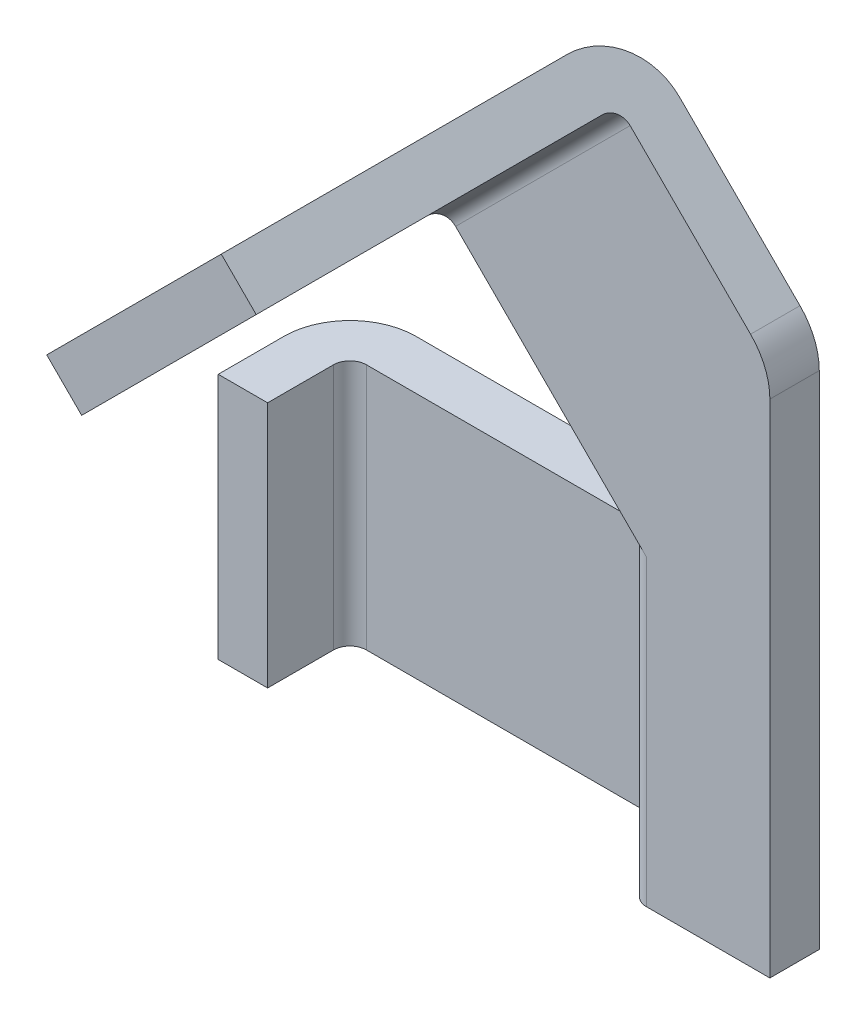
ISO-10303-21;
HEADER;
FILE_DESCRIPTION(('STEP AP214'),'2;1');
FILE_NAME('part.step','',(''),(''),'','','');
FILE_SCHEMA(('AUTOMOTIVE_DESIGN { 1 0 10303 214 1 1 1 1 }'));
ENDSEC;
DATA;
#1=APPLICATION_CONTEXT('core data for automotive mechanical design processes');
#2=APPLICATION_PROTOCOL_DEFINITION('international standard','automotive_design',2000,#1);
#3=PRODUCT_CONTEXT('',#1,'mechanical');
#4=PRODUCT('Part','Part','',(#3));
#5=PRODUCT_RELATED_PRODUCT_CATEGORY('part','',(#4));
#6=PRODUCT_DEFINITION_FORMATION('','',#4);
#7=PRODUCT_DEFINITION_CONTEXT('part definition',#1,'design');
#8=PRODUCT_DEFINITION('design','',#6,#7);
#9=PRODUCT_DEFINITION_SHAPE('','',#8);
#10=(LENGTH_UNIT() NAMED_UNIT(*) SI_UNIT(.MILLI.,.METRE.));
#11=(NAMED_UNIT(*) PLANE_ANGLE_UNIT() SI_UNIT($,.RADIAN.));
#12=(NAMED_UNIT(*) SI_UNIT($,.STERADIAN.) SOLID_ANGLE_UNIT());
#13=UNCERTAINTY_MEASURE_WITH_UNIT(LENGTH_MEASURE(1.E-05),#10,'distance_accuracy_value','');
#14=(GEOMETRIC_REPRESENTATION_CONTEXT(3) GLOBAL_UNCERTAINTY_ASSIGNED_CONTEXT((#13)) GLOBAL_UNIT_ASSIGNED_CONTEXT((#10,
#11,#12)) REPRESENTATION_CONTEXT('',''));
#15=CARTESIAN_POINT('',(0.,0.,0.));
#16=DIRECTION('',(0.,0.,1.));
#17=DIRECTION('',(1.,0.,0.));
#18=AXIS2_PLACEMENT_3D('',#15,#16,#17);
#19=CARTESIAN_POINT('',(-15.35,15.21,2.2));
#20=DIRECTION('',(-1.,0.,0.));
#21=DIRECTION('',(0.,0.,1.));
#22=AXIS2_PLACEMENT_3D('',#19,#20,#21);
#23=PLANE('',#22);
#24=DIRECTION('',(0.,-1.,0.));
#25=VECTOR('',#24,1.);
#26=CARTESIAN_POINT('',(-15.35000000001,15.04431457506,2.50000000001));
#27=LINE('',#26,#25);
#28=CARTESIAN_POINT('',(-15.35,15.04431457505,2.5));
#29=VERTEX_POINT('',#28);
#30=CARTESIAN_POINT('',(-15.35,12.,2.5));
#31=VERTEX_POINT('',#30);
#32=EDGE_CURVE('E315',#29,#31,#27,.T.);
#33=ORIENTED_EDGE('',*,*,#32,.T.);
#34=DIRECTION('',(0.,0.,1.));
#35=VECTOR('',#34,1.);
#36=CARTESIAN_POINT('',(-15.35000000001,12.00000000001,2.20000000001));
#37=LINE('',#36,#35);
#38=CARTESIAN_POINT('',(-15.35,12.,2.2));
#39=VERTEX_POINT('',#38);
#40=EDGE_CURVE('E306',#39,#31,#37,.T.);
#41=ORIENTED_EDGE('',*,*,#40,.F.);
#42=DIRECTION('',(0.,1.,0.));
#43=VECTOR('',#42,1.);
#44=CARTESIAN_POINT('',(-15.35000000001,12.00000000001,2.20000000001));
#45=LINE('',#44,#43);
#46=CARTESIAN_POINT('',(-15.35,15.04431457505,2.2));
#47=VERTEX_POINT('',#46);
#48=EDGE_CURVE('E404',#39,#47,#45,.T.);
#49=ORIENTED_EDGE('',*,*,#48,.T.);
#50=DIRECTION('',(0.,0.,-1.));
#51=VECTOR('',#50,1.);
#52=CARTESIAN_POINT('',(-15.35000000001,15.04431457506,2.50000000001));
#53=LINE('',#52,#51);
#54=EDGE_CURVE('E316',#29,#47,#53,.T.);
#55=ORIENTED_EDGE('',*,*,#54,.F.);
#56=EDGE_LOOP('',(#33,#41,#49,#55));
#57=FACE_BOUND('',#56,.T.);
#58=ADVANCED_FACE('F17',(#57),#23,.F.);
#59=CARTESIAN_POINT('',(-18.7,12.,2.5));
#60=DIRECTION('',(0.,0.,1.));
#61=DIRECTION('',(1.,0.,0.));
#62=AXIS2_PLACEMENT_3D('',#59,#60,#61);
#63=PLANE('',#62);
#64=DIRECTION('',(1.,0.,0.));
#65=VECTOR('',#64,1.);
#66=CARTESIAN_POINT('',(-18.70000000001,13.50000000001,2.50000000001));
#67=LINE('',#66,#65);
#68=CARTESIAN_POINT('',(-18.7,13.5,2.5));
#69=VERTEX_POINT('',#68);
#70=CARTESIAN_POINT('',(-18.4,13.5,2.5));
#71=VERTEX_POINT('',#70);
#72=EDGE_CURVE('E254',#69,#71,#67,.T.);
#73=ORIENTED_EDGE('',*,*,#72,.F.);
#74=DIRECTION('',(0.,1.,0.));
#75=VECTOR('',#74,1.);
#76=CARTESIAN_POINT('',(-18.70000000001,12.00000000001,2.50000000001));
#77=LINE('',#76,#75);
#78=CARTESIAN_POINT('',(-18.7,12.,2.5));
#79=VERTEX_POINT('',#78);
#80=EDGE_CURVE('E247',#79,#69,#77,.T.);
#81=ORIENTED_EDGE('',*,*,#80,.F.);
#82=DIRECTION('',(-1.,0.,0.));
#83=VECTOR('',#82,1.);
#84=CARTESIAN_POINT('',(-18.40000000001,12.00000000001,2.50000000001));
#85=LINE('',#84,#83);
#86=CARTESIAN_POINT('',(-18.4,12.,2.5));
#87=VERTEX_POINT('',#86);
#88=EDGE_CURVE('E228',#87,#79,#85,.T.);
#89=ORIENTED_EDGE('',*,*,#88,.F.);
#90=DIRECTION('',(0.,-1.,0.));
#91=VECTOR('',#90,1.);
#92=CARTESIAN_POINT('',(-18.40000000001,13.50000000001,2.50000000001));
#93=LINE('',#92,#91);
#94=EDGE_CURVE('E11',#71,#87,#93,.T.);
#95=ORIENTED_EDGE('',*,*,#94,.F.);
#96=EDGE_LOOP('',(#73,#81,#89,#95));
#97=FACE_BOUND('',#96,.T.);
#98=ADVANCED_FACE('F19',(#97),#63,.T.);
#99=CARTESIAN_POINT('',(-18.4,12.,2.5));
#100=DIRECTION('',(-1.,0.,0.));
#101=DIRECTION('',(0.,0.,1.));
#102=AXIS2_PLACEMENT_3D('',#99,#100,#101);
#103=PLANE('',#102);
#104=DIRECTION('',(2.5088817841324E-11,0.,1.));
#105=VECTOR('',#104,1.);
#106=CARTESIAN_POINT('',(-18.40000000001,13.50000000001,2.10000000001));
#107=LINE('',#106,#105);
#108=CARTESIAN_POINT('',(-18.4,13.5,2.1));
#109=VERTEX_POINT('',#108);
#110=EDGE_CURVE('E361',#109,#71,#107,.T.);
#111=ORIENTED_EDGE('',*,*,#110,.T.);
#112=ORIENTED_EDGE('',*,*,#94,.T.);
#113=DIRECTION('',(-2.5088817841324E-11,0.,-1.));
#114=VECTOR('',#113,1.);
#115=CARTESIAN_POINT('',(-18.40000000001,12.00000000001,2.50000000001));
#116=LINE('',#115,#114);
#117=CARTESIAN_POINT('',(-18.4,12.,2.1));
#118=VERTEX_POINT('',#117);
#119=EDGE_CURVE('E237',#87,#118,#116,.T.);
#120=ORIENTED_EDGE('',*,*,#119,.T.);
#121=DIRECTION('',(0.,-1.,0.));
#122=VECTOR('',#121,1.);
#123=CARTESIAN_POINT('',(-18.40000000001,13.50000000001,2.10000000001));
#124=LINE('',#123,#122);
#125=EDGE_CURVE('E27',#109,#118,#124,.T.);
#126=ORIENTED_EDGE('',*,*,#125,.F.);
#127=EDGE_LOOP('',(#111,#112,#120,#126));
#128=FACE_BOUND('',#127,.T.);
#129=ADVANCED_FACE('F701',(#128),#103,.F.);
#130=CARTESIAN_POINT('',(-18.3,12.,2.1));
#131=DIRECTION('',(0.,1.,0.));
#132=DIRECTION('',(0.,0.,-1.));
#133=AXIS2_PLACEMENT_3D('',#130,#131,#132);
#134=CYLINDRICAL_SURFACE('',#133,0.1);
#135=ORIENTED_EDGE('',*,*,#125,.T.);
#136=CARTESIAN_POINT('',(-18.30000000001,12.00000000001,2.10000000001));
#137=DIRECTION('',(0.,1.,0.));
#138=DIRECTION('',(0.,0.,-1.));
#139=AXIS2_PLACEMENT_3D('',#136,#137,#138);
#140=CIRCLE('',#139,0.10000000001);
#141=CARTESIAN_POINT('',(-18.3,12.,2.));
#142=VERTEX_POINT('',#141);
#143=EDGE_CURVE('E296',#142,#118,#140,.T.);
#144=ORIENTED_EDGE('',*,*,#143,.F.);
#145=DIRECTION('',(0.,1.,0.));
#146=VECTOR('',#145,1.);
#147=CARTESIAN_POINT('',(-18.30000000001,12.00000000001,2.00000000001));
#148=LINE('',#147,#146);
#149=CARTESIAN_POINT('',(-18.3,13.5,2.));
#150=VERTEX_POINT('',#149);
#151=EDGE_CURVE('E310',#142,#150,#148,.T.);
#152=ORIENTED_EDGE('',*,*,#151,.T.);
#153=CARTESIAN_POINT('',(-18.30000000001,13.50000000001,2.10000000001));
#154=DIRECTION('',(0.,-1.,0.));
#155=DIRECTION('',(-1.,0.,-1.07798206514187E-10));
#156=AXIS2_PLACEMENT_3D('',#153,#154,#155);
#157=CIRCLE('',#156,0.10000000001);
#158=EDGE_CURVE('E365',#109,#150,#157,.T.);
#159=ORIENTED_EDGE('',*,*,#158,.F.);
#160=EDGE_LOOP('',(#135,#144,#152,#159));
#161=FACE_BOUND('',#160,.T.);
#162=ADVANCED_FACE('F707',(#161),#134,.F.);
#163=CARTESIAN_POINT('',(-18.7,12.,2.));
#164=DIRECTION('',(0.,0.,-1.));
#165=DIRECTION('',(0.,-1.,0.));
#166=AXIS2_PLACEMENT_3D('',#163,#164,#165);
#167=PLANE('',#166);
#168=DIRECTION('',(-1.,0.,0.));
#169=VECTOR('',#168,1.);
#170=CARTESIAN_POINT('',(-16.30000000001,13.50000000001,2.00000000001));
#171=LINE('',#170,#169);
#172=CARTESIAN_POINT('',(-16.3,13.5,2.));
#173=VERTEX_POINT('',#172);
#174=EDGE_CURVE('E369',#173,#150,#171,.T.);
#175=ORIENTED_EDGE('',*,*,#174,.T.);
#176=ORIENTED_EDGE('',*,*,#151,.F.);
#177=DIRECTION('',(1.,0.,0.));
#178=VECTOR('',#177,1.);
#179=CARTESIAN_POINT('',(-18.30000000001,12.00000000001,2.00000000001));
#180=LINE('',#179,#178);
#181=CARTESIAN_POINT('',(-16.3,12.,2.));
#182=VERTEX_POINT('',#181);
#183=EDGE_CURVE('E292',#142,#182,#180,.T.);
#184=ORIENTED_EDGE('',*,*,#183,.T.);
#185=DIRECTION('',(0.,-1.,0.));
#186=VECTOR('',#185,1.);
#187=CARTESIAN_POINT('',(-16.30000000001,13.50000000001,2.00000000001));
#188=LINE('',#187,#186);
#189=EDGE_CURVE('E307',#173,#182,#188,.T.);
#190=ORIENTED_EDGE('',*,*,#189,.F.);
#191=EDGE_LOOP('',(#175,#176,#184,#190));
#192=FACE_BOUND('',#191,.T.);
#193=ADVANCED_FACE('F537',(#192),#167,.F.);
#194=CARTESIAN_POINT('',(-16.3,12.,2.1));
#195=DIRECTION('',(0.,1.,0.));
#196=DIRECTION('',(0.,0.,-1.));
#197=AXIS2_PLACEMENT_3D('',#194,#195,#196);
#198=CYLINDRICAL_SURFACE('',#197,0.1);
#199=ORIENTED_EDGE('',*,*,#189,.T.);
#200=CARTESIAN_POINT('',(-16.30000000001,12.00000000001,2.10000000001));
#201=DIRECTION('',(0.,1.,0.));
#202=DIRECTION('',(1.,0.,-1.07536193880401E-10));
#203=AXIS2_PLACEMENT_3D('',#200,#201,#202);
#204=CIRCLE('',#203,0.10000000001);
#205=CARTESIAN_POINT('',(-16.2,12.,2.1));
#206=VERTEX_POINT('',#205);
#207=EDGE_CURVE('E288',#206,#182,#204,.T.);
#208=ORIENTED_EDGE('',*,*,#207,.F.);
#209=DIRECTION('',(0.,1.,0.));
#210=VECTOR('',#209,1.);
#211=CARTESIAN_POINT('',(-16.20000000001,12.00000000001,2.10000000001));
#212=LINE('',#211,#210);
#213=CARTESIAN_POINT('',(-16.2,13.5,2.099999999999));
#214=VERTEX_POINT('',#213);
#215=EDGE_CURVE('E311',#206,#214,#212,.T.);
#216=ORIENTED_EDGE('',*,*,#215,.T.);
#217=CARTESIAN_POINT('',(-16.30000000001,13.50000000001,2.10000000001));
#218=DIRECTION('',(0.,-1.,0.));
#219=DIRECTION('',(0.,0.,-1.));
#220=AXIS2_PLACEMENT_3D('',#217,#218,#219);
#221=CIRCLE('',#220,0.10000000001);
#222=EDGE_CURVE('E373',#173,#214,#221,.T.);
#223=ORIENTED_EDGE('',*,*,#222,.F.);
#224=EDGE_LOOP('',(#199,#208,#216,#223));
#225=FACE_BOUND('',#224,.T.);
#226=ADVANCED_FACE('F533',(#225),#198,.F.);
#227=CARTESIAN_POINT('',(-16.2,12.,2.2));
#228=DIRECTION('',(1.,0.,0.));
#229=DIRECTION('',(0.,1.,0.));
#230=AXIS2_PLACEMENT_3D('',#227,#228,#229);
#231=PLANE('',#230);
#232=DIRECTION('',(3.34517571214782E-11,0.,-1.));
#233=VECTOR('',#232,1.);
#234=CARTESIAN_POINT('',(-16.20000000001,12.00000000001,2.40000000001));
#235=LINE('',#234,#233);
#236=CARTESIAN_POINT('',(-16.2,12.,2.4));
#237=VERTEX_POINT('',#236);
#238=EDGE_CURVE('E293',#237,#206,#235,.T.);
#239=ORIENTED_EDGE('',*,*,#238,.F.);
#240=DIRECTION('',(0.,-1.,0.));
#241=VECTOR('',#240,1.);
#242=CARTESIAN_POINT('',(-16.20000000001,13.94000000001,2.40000000001));
#243=LINE('',#242,#241);
#244=CARTESIAN_POINT('',(-16.2,13.94,2.4));
#245=VERTEX_POINT('',#244);
#246=EDGE_CURVE('E567',#245,#237,#243,.T.);
#247=ORIENTED_EDGE('',*,*,#246,.F.);
#248=DIRECTION('',(0.,-5.0159872113038E-11,1.));
#249=VECTOR('',#248,1.);
#250=CARTESIAN_POINT('',(-16.20000000001,13.94000000001,2.20000000001));
#251=LINE('',#250,#249);
#252=CARTESIAN_POINT('',(-16.2,13.94,2.2));
#253=VERTEX_POINT('',#252);
#254=EDGE_CURVE('E455',#253,#245,#251,.T.);
#255=ORIENTED_EDGE('',*,*,#254,.F.);
#256=DIRECTION('',(0.,-1.,0.));
#257=VECTOR('',#256,1.);
#258=CARTESIAN_POINT('',(-16.20000000001,13.94000000001,2.20000000001));
#259=LINE('',#258,#257);
#260=CARTESIAN_POINT('',(-16.2,13.5,2.2));
#261=VERTEX_POINT('',#260);
#262=EDGE_CURVE('E408',#253,#261,#259,.T.);
#263=ORIENTED_EDGE('',*,*,#262,.T.);
#264=DIRECTION('',(-1.00319744220759E-10,0.,1.));
#265=VECTOR('',#264,1.);
#266=CARTESIAN_POINT('',(-16.20000000001,13.50000000001,2.10000000001));
#267=LINE('',#266,#265);
#268=EDGE_CURVE('E377',#214,#261,#267,.T.);
#269=ORIENTED_EDGE('',*,*,#268,.F.);
#270=ORIENTED_EDGE('',*,*,#215,.F.);
#271=EDGE_LOOP('',(#239,#247,#255,#263,#269,#270));
#272=FACE_BOUND('',#271,.T.);
#273=ADVANCED_FACE('F536',(#272),#231,.F.);
#274=CARTESIAN_POINT('',(-16.19852813742,16.05852813742,2.6));
#275=DIRECTION('',(0.707106781186548,0.707106781186548,0.));
#276=DIRECTION('',(0.707106781186548,-0.707106781186548,0.));
#277=AXIS2_PLACEMENT_3D('',#274,#275,#276);
#278=CYLINDRICAL_SURFACE('',#277,0.1);
#279=DIRECTION('',(-0.707106781186548,-0.707106781186548,0.));
#280=VECTOR('',#279,1.);
#281=CARTESIAN_POINT('',(-16.26923881555,16.12923881555,2.600000000011));
#282=LINE('',#281,#280);
#283=CARTESIAN_POINT('',(-16.26923881554,16.12923881554,2.600000000001));
#284=VERTEX_POINT('',#283);
#285=CARTESIAN_POINT('',(-17.32923881554,15.06923881554,2.600000000001));
#286=VERTEX_POINT('',#285);
#287=EDGE_CURVE('E394',#284,#286,#282,.T.);
#288=ORIENTED_EDGE('',*,*,#287,.T.);
#289=CARTESIAN_POINT('',(-17.25852813743,14.99852813743,2.60000000001));
#290=DIRECTION('',(0.707106781186548,0.707106781186548,0.));
#291=DIRECTION('',(0.,0.,-1.));
#292=AXIS2_PLACEMENT_3D('',#289,#290,#291);
#293=CIRCLE('',#292,0.10000000001);
#294=CARTESIAN_POINT('',(-17.25852813742,14.99852813742,2.5));
#295=VERTEX_POINT('',#294);
#296=EDGE_CURVE('E451',#295,#286,#293,.T.);
#297=ORIENTED_EDGE('',*,*,#296,.F.);
#298=DIRECTION('',(-0.707106781186548,-0.707106781186548,0.));
#299=VECTOR('',#298,1.);
#300=CARTESIAN_POINT('',(-16.19852813743,16.05852813743,2.50000000001));
#301=LINE('',#300,#299);
#302=CARTESIAN_POINT('',(-16.19852813742,16.05852813742,2.5));
#303=VERTEX_POINT('',#302);
#304=EDGE_CURVE('E442',#303,#295,#301,.T.);
#305=ORIENTED_EDGE('',*,*,#304,.F.);
#306=CARTESIAN_POINT('',(-16.19852813743,16.05852813743,2.60000000001));
#307=DIRECTION('',(-0.707106781186548,-0.707106781186548,0.));
#308=DIRECTION('',(-0.707106781186548,0.707106781186548,1.36921576887569E-10));
#309=AXIS2_PLACEMENT_3D('',#306,#307,#308);
#310=CIRCLE('',#309,0.100000000014142);
#311=EDGE_CURVE('E431',#284,#303,#310,.T.);
#312=ORIENTED_EDGE('',*,*,#311,.F.);
#313=EDGE_LOOP('',(#288,#297,#305,#312));
#314=FACE_BOUND('',#313,.T.);
#315=ADVANCED_FACE('F542',(#314),#278,.F.);
#316=CARTESIAN_POINT('',(-16.26923881554,16.12923881554,4.7));
#317=DIRECTION('',(0.707106781186548,-0.707106781186548,0.));
#318=DIRECTION('',(0.,0.,-1.));
#319=AXIS2_PLACEMENT_3D('',#316,#317,#318);
#320=PLANE('',#319);
#321=DIRECTION('',(0.707106781186548,0.707106781186548,0.));
#322=VECTOR('',#321,1.);
#323=CARTESIAN_POINT('',(-17.32923881555,15.06923881555,4.70000000001));
#324=LINE('',#323,#322);
#325=CARTESIAN_POINT('',(-17.32923881554,15.06923881554,4.7));
#326=VERTEX_POINT('',#325);
#327=CARTESIAN_POINT('',(-16.26923881554,16.12923881554,4.7));
#328=VERTEX_POINT('',#327);
#329=EDGE_CURVE('E50',#326,#328,#324,.T.);
#330=ORIENTED_EDGE('',*,*,#329,.F.);
#331=DIRECTION('',(-4.81604135127538E-12,4.81604135127538E-12,1.));
#332=VECTOR('',#331,1.);
#333=CARTESIAN_POINT('',(-17.32923881555,15.06923881555,2.600000000011));
#334=LINE('',#333,#332);
#335=EDGE_CURVE('E342',#286,#326,#334,.T.);
#336=ORIENTED_EDGE('',*,*,#335,.F.);
#337=ORIENTED_EDGE('',*,*,#287,.F.);
#338=DIRECTION('',(4.82450019336772E-12,-4.81096604601997E-12,-1.));
#339=VECTOR('',#338,1.);
#340=CARTESIAN_POINT('',(-16.26923881555,16.12923881555,4.70000000001));
#341=LINE('',#340,#339);
#342=EDGE_CURVE('E427',#328,#284,#341,.T.);
#343=ORIENTED_EDGE('',*,*,#342,.F.);
#344=EDGE_LOOP('',(#330,#336,#337,#343));
#345=FACE_BOUND('',#344,.T.);
#346=ADVANCED_FACE('F545',(#345),#320,.T.);
#347=CARTESIAN_POINT('',(-16.26923881554,16.12923881554,4.7));
#348=DIRECTION('',(0.,0.,-1.));
#349=DIRECTION('',(0.,-1.,0.));
#350=AXIS2_PLACEMENT_3D('',#347,#348,#349);
#351=PLANE('',#350);
#352=DIRECTION('',(0.707106781186298,-0.707106781186798,0.));
#353=VECTOR('',#352,1.);
#354=CARTESIAN_POINT('',(-17.54137084991,15.28137084991,4.70000000001));
#355=LINE('',#354,#353);
#356=CARTESIAN_POINT('',(-17.5413708499,15.2813708499,4.7));
#357=VERTEX_POINT('',#356);
#358=EDGE_CURVE('E338',#357,#326,#355,.T.);
#359=ORIENTED_EDGE('',*,*,#358,.T.);
#360=ORIENTED_EDGE('',*,*,#329,.T.);
#361=DIRECTION('',(-0.707106781186597,0.707106781186498,0.));
#362=VECTOR('',#361,1.);
#363=CARTESIAN_POINT('',(-16.26923881555,16.12923881555,4.70000000001));
#364=LINE('',#363,#362);
#365=CARTESIAN_POINT('',(-16.4813708499,16.3413708499,4.7));
#366=VERTEX_POINT('',#365);
#367=EDGE_CURVE('E333',#328,#366,#364,.T.);
#368=ORIENTED_EDGE('',*,*,#367,.T.);
#369=DIRECTION('',(-0.707106781186548,-0.707106781186548,0.));
#370=VECTOR('',#369,1.);
#371=CARTESIAN_POINT('',(-16.48137084991,16.34137084991,4.70000000001));
#372=LINE('',#371,#370);
#373=EDGE_CURVE('E40',#366,#357,#372,.T.);
#374=ORIENTED_EDGE('',*,*,#373,.T.);
#375=EDGE_LOOP('',(#359,#360,#368,#374));
#376=FACE_BOUND('',#375,.T.);
#377=ADVANCED_FACE('F547',(#376),#351,.F.);
#378=CARTESIAN_POINT('',(-17.5413708499,15.2813708499,4.7));
#379=DIRECTION('',(-0.707106781186548,0.707106781186548,0.));
#380=DIRECTION('',(0.,0.,1.));
#381=AXIS2_PLACEMENT_3D('',#378,#379,#380);
#382=PLANE('',#381);
#383=ORIENTED_EDGE('',*,*,#373,.F.);
#384=DIRECTION('',(4.80419897233923E-12,-4.8211166565239E-12,1.));
#385=VECTOR('',#384,1.);
#386=CARTESIAN_POINT('',(-16.48137084991,16.34137084991,2.600000000008));
#387=LINE('',#386,#385);
#388=CARTESIAN_POINT('',(-16.4813708499,16.3413708499,2.599999999995));
#389=VERTEX_POINT('',#388);
#390=EDGE_CURVE('E329',#389,#366,#387,.T.);
#391=ORIENTED_EDGE('',*,*,#390,.F.);
#392=DIRECTION('',(0.707106781186548,0.707106781186548,0.));
#393=VECTOR('',#392,1.);
#394=CARTESIAN_POINT('',(-17.54137084991,15.28137084991,2.600000000008));
#395=LINE('',#394,#393);
#396=CARTESIAN_POINT('',(-17.5413708499,15.2813708499,2.599999999998));
#397=VERTEX_POINT('',#396);
#398=EDGE_CURVE('E268',#397,#389,#395,.T.);
#399=ORIENTED_EDGE('',*,*,#398,.F.);
#400=DIRECTION('',(-4.84987671963784E-12,4.77543890922529E-12,-1.));
#401=VECTOR('',#400,1.);
#402=CARTESIAN_POINT('',(-17.54137084991,15.28137084991,4.70000000001));
#403=LINE('',#402,#401);
#404=EDGE_CURVE('E341',#357,#397,#403,.T.);
#405=ORIENTED_EDGE('',*,*,#404,.F.);
#406=EDGE_LOOP('',(#383,#391,#399,#405));
#407=FACE_BOUND('',#406,.T.);
#408=ADVANCED_FACE('F488',(#407),#382,.T.);
#409=CARTESIAN_POINT('',(-16.2,13.94,2.2));
#410=DIRECTION('',(0.707106781186548,0.707106781186548,0.));
#411=DIRECTION('',(0.,0.,-1.));
#412=AXIS2_PLACEMENT_3D('',#409,#410,#411);
#413=PLANE('',#412);
#414=DIRECTION('',(-0.707106781186498,0.707106781186597,0.));
#415=VECTOR('',#414,1.);
#416=CARTESIAN_POINT('',(-16.20000000001,13.94000000001,2.20000000001));
#417=LINE('',#416,#415);
#418=CARTESIAN_POINT('',(-17.25852813742,14.99852813742,2.2));
#419=VERTEX_POINT('',#418);
#420=EDGE_CURVE('E349',#253,#419,#417,.T.);
#421=ORIENTED_EDGE('',*,*,#420,.F.);
#422=ORIENTED_EDGE('',*,*,#254,.T.);
#423=CARTESIAN_POINT('',(-16.20000000001,13.94000000001,2.40000000001));
#424=CARTESIAN_POINT('',(-16.20000000001,13.94000000001,2.44457753182114));
#425=CARTESIAN_POINT('',(-16.1694014824538,13.9094014824538,2.47329429084867));
#426=CARTESIAN_POINT('',(-16.1409457953116,13.8809457953116,2.50000000001));
#427=CARTESIAN_POINT('',(-16.10000000001,13.84000000001,2.50000000001));
#428=B_SPLINE_CURVE_WITH_KNOTS('',2,(#423,#424,#425,#426,#427),.UNSPECIFIED.,.F.,.F.,(3,2,3),
(0.,0.5,1.),.UNSPECIFIED.);
#429=CARTESIAN_POINT('',(-16.1,13.84,2.5));
#430=VERTEX_POINT('',#429);
#431=EDGE_CURVE('E471',#245,#430,#428,.T.);
#432=ORIENTED_EDGE('',*,*,#431,.T.);
#433=DIRECTION('',(0.707106781186498,-0.707106781186597,0.));
#434=VECTOR('',#433,1.);
#435=CARTESIAN_POINT('',(-17.25852813743,14.99852813743,2.50000000001));
#436=LINE('',#435,#434);
#437=EDGE_CURVE('E446',#295,#430,#436,.T.);
#438=ORIENTED_EDGE('',*,*,#437,.F.);
#439=ORIENTED_EDGE('',*,*,#296,.T.);
#440=ORIENTED_EDGE('',*,*,#335,.T.);
#441=ORIENTED_EDGE('',*,*,#358,.F.);
#442=ORIENTED_EDGE('',*,*,#404,.T.);
#443=CARTESIAN_POINT('',(-17.25852813743,14.99852813743,2.60000000001));
#444=DIRECTION('',(-0.707106781186548,-0.707106781186548,0.));
#445=DIRECTION('',(-0.707106781186548,0.707106781186548,-3.63564713176053E-11));
#446=AXIS2_PLACEMENT_3D('',#443,#444,#445);
#447=CIRCLE('',#446,0.400000000014142);
#448=EDGE_CURVE('E266',#397,#419,#447,.T.);
#449=ORIENTED_EDGE('',*,*,#448,.T.);
#450=EDGE_LOOP('',(#421,#422,#432,#438,#439,#440,#441,#442,#449));
#451=FACE_BOUND('',#450,.T.);
#452=ADVANCED_FACE('F478',(#451),#413,.F.);
#453=CARTESIAN_POINT('',(-16.1,12.,2.4));
#454=DIRECTION('',(0.,1.,0.));
#455=DIRECTION('',(0.,0.,-1.));
#456=AXIS2_PLACEMENT_3D('',#453,#454,#455);
#457=CYLINDRICAL_SURFACE('',#456,0.1);
#458=ORIENTED_EDGE('',*,*,#246,.T.);
#459=CARTESIAN_POINT('',(-16.10000000001,12.00000000001,2.40000000001));
#460=DIRECTION('',(0.,-1.,0.));
#461=DIRECTION('',(0.,0.,1.));
#462=AXIS2_PLACEMENT_3D('',#459,#460,#461);
#463=CIRCLE('',#462,0.10000000001);
#464=CARTESIAN_POINT('',(-16.1,12.,2.5));
#465=VERTEX_POINT('',#464);
#466=EDGE_CURVE('E302',#465,#237,#463,.T.);
#467=ORIENTED_EDGE('',*,*,#466,.F.);
#468=DIRECTION('',(0.,1.,0.));
#469=VECTOR('',#468,1.);
#470=CARTESIAN_POINT('',(-16.10000000001,12.00000000001,2.50000000001));
#471=LINE('',#470,#469);
#472=EDGE_CURVE('E570',#465,#430,#471,.T.);
#473=ORIENTED_EDGE('',*,*,#472,.T.);
#474=ORIENTED_EDGE('',*,*,#431,.F.);
#475=EDGE_LOOP('',(#458,#467,#473,#474));
#476=FACE_BOUND('',#475,.T.);
#477=ADVANCED_FACE('F487',(#476),#457,.T.);
#478=CARTESIAN_POINT('',(-16.26923881554,16.12923881554,2.5));
#479=DIRECTION('',(0.,0.,1.));
#480=DIRECTION('',(1.,0.,0.));
#481=AXIS2_PLACEMENT_3D('',#478,#479,#480);
#482=PLANE('',#481);
#483=DIRECTION('',(-1.,0.,0.));
#484=VECTOR('',#483,1.);
#485=CARTESIAN_POINT('',(-15.35000000001,12.00000000001,2.50000000001));
#486=LINE('',#485,#484);
#487=EDGE_CURVE('E325',#31,#465,#486,.T.);
#488=ORIENTED_EDGE('',*,*,#487,.F.);
#489=ORIENTED_EDGE('',*,*,#32,.F.);
#490=CARTESIAN_POINT('',(-15.75000000001,15.04431457506,2.50000000001));
#491=DIRECTION('',(0.,0.,1.));
#492=DIRECTION('',(1.,0.,0.));
#493=AXIS2_PLACEMENT_3D('',#490,#491,#492);
#494=CIRCLE('',#493,0.40000000001);
#495=CARTESIAN_POINT('',(-15.46715728752,15.32715728752,2.5));
#496=VERTEX_POINT('',#495);
#497=EDGE_CURVE('E312',#29,#496,#494,.T.);
#498=ORIENTED_EDGE('',*,*,#497,.T.);
#499=DIRECTION('',(-0.707106781186597,0.707106781186498,0.));
#500=VECTOR('',#499,1.);
#501=CARTESIAN_POINT('',(-15.46715728753,15.32715728753,2.50000000001));
#502=LINE('',#501,#500);
#503=EDGE_CURVE('E413',#496,#303,#502,.T.);
#504=ORIENTED_EDGE('',*,*,#503,.T.);
#505=ORIENTED_EDGE('',*,*,#304,.T.);
#506=ORIENTED_EDGE('',*,*,#437,.T.);
#507=ORIENTED_EDGE('',*,*,#472,.F.);
#508=EDGE_LOOP('',(#488,#489,#498,#504,#505,#506,#507));
#509=FACE_BOUND('',#508,.T.);
#510=ADVANCED_FACE('F531',(#509),#482,.T.);
#511=CARTESIAN_POINT('',(-15.75,15.04431457505,2.2));
#512=DIRECTION('',(0.,0.,-1.));
#513=DIRECTION('',(0.,-1.,0.));
#514=AXIS2_PLACEMENT_3D('',#511,#512,#513);
#515=CYLINDRICAL_SURFACE('',#514,0.4);
#516=ORIENTED_EDGE('',*,*,#54,.T.);
#517=CARTESIAN_POINT('',(-15.75000000001,15.04431457506,2.20000000001));
#518=DIRECTION('',(0.,0.,-1.));
#519=DIRECTION('',(0.707106781190198,0.707106781182898,0.));
#520=AXIS2_PLACEMENT_3D('',#517,#518,#519);
#521=CIRCLE('',#520,0.400000000014142);
#522=CARTESIAN_POINT('',(-15.46715728752,15.32715728752,2.2));
#523=VERTEX_POINT('',#522);
#524=EDGE_CURVE('E400',#523,#47,#521,.T.);
#525=ORIENTED_EDGE('',*,*,#524,.F.);
#526=DIRECTION('',(0.,0.,1.));
#527=VECTOR('',#526,1.);
#528=CARTESIAN_POINT('',(-15.46715728753,15.32715728753,2.20000000001));
#529=LINE('',#528,#527);
#530=EDGE_CURVE('E409',#523,#496,#529,.T.);
#531=ORIENTED_EDGE('',*,*,#530,.T.);
#532=ORIENTED_EDGE('',*,*,#497,.F.);
#533=EDGE_LOOP('',(#516,#525,#531,#532));
#534=FACE_BOUND('',#533,.T.);
#535=ADVANCED_FACE('F524',(#534),#515,.T.);
#536=CARTESIAN_POINT('',(-15.35,15.21,2.2));
#537=DIRECTION('',(-0.707106781186548,-0.707106781186548,0.));
#538=DIRECTION('',(-0.707106781186548,0.707106781186548,0.));
#539=AXIS2_PLACEMENT_3D('',#536,#537,#538);
#540=PLANE('',#539);
#541=ORIENTED_EDGE('',*,*,#390,.T.);
#542=ORIENTED_EDGE('',*,*,#367,.F.);
#543=ORIENTED_EDGE('',*,*,#342,.T.);
#544=ORIENTED_EDGE('',*,*,#311,.T.);
#545=ORIENTED_EDGE('',*,*,#503,.F.);
#546=ORIENTED_EDGE('',*,*,#530,.F.);
#547=DIRECTION('',(0.707106781186597,-0.707106781186498,0.));
#548=VECTOR('',#547,1.);
#549=CARTESIAN_POINT('',(-16.19852813743,16.05852813743,2.20000000001));
#550=LINE('',#549,#548);
#551=CARTESIAN_POINT('',(-16.19852813742,16.05852813742,2.2));
#552=VERTEX_POINT('',#551);
#553=EDGE_CURVE('E320',#552,#523,#550,.T.);
#554=ORIENTED_EDGE('',*,*,#553,.F.);
#555=CARTESIAN_POINT('',(-16.19852813743,16.05852813743,2.60000000001));
#556=DIRECTION('',(0.707106781186548,0.707106781186548,0.));
#557=DIRECTION('',(0.,0.,-1.));
#558=AXIS2_PLACEMENT_3D('',#555,#556,#557);
#559=CIRCLE('',#558,0.40000000001);
#560=EDGE_CURVE('E334',#552,#389,#559,.T.);
#561=ORIENTED_EDGE('',*,*,#560,.T.);
#562=EDGE_LOOP('',(#541,#542,#543,#544,#545,#546,#554,#561));
#563=FACE_BOUND('',#562,.T.);
#564=ADVANCED_FACE('F521',(#563),#540,.F.);
#565=CARTESIAN_POINT('',(-16.19852813742,16.05852813742,2.6));
#566=DIRECTION('',(0.707106781186548,0.707106781186548,0.));
#567=DIRECTION('',(0.707106781186548,-0.707106781186548,0.));
#568=AXIS2_PLACEMENT_3D('',#565,#566,#567);
#569=CYLINDRICAL_SURFACE('',#568,0.4);
#570=DIRECTION('',(0.707106781186548,0.707106781186548,0.));
#571=VECTOR('',#570,1.);
#572=CARTESIAN_POINT('',(-17.25852813743,14.99852813743,2.20000000001));
#573=LINE('',#572,#571);
#574=EDGE_CURVE('E269',#419,#552,#573,.T.);
#575=ORIENTED_EDGE('',*,*,#574,.F.);
#576=ORIENTED_EDGE('',*,*,#448,.F.);
#577=ORIENTED_EDGE('',*,*,#398,.T.);
#578=ORIENTED_EDGE('',*,*,#560,.F.);
#579=EDGE_LOOP('',(#575,#576,#577,#578));
#580=FACE_BOUND('',#579,.T.);
#581=ADVANCED_FACE('F519',(#580),#569,.T.);
#582=CARTESIAN_POINT('',(-16.26923881554,16.12923881554,2.2));
#583=DIRECTION('',(0.,0.,1.));
#584=DIRECTION('',(1.,0.,0.));
#585=AXIS2_PLACEMENT_3D('',#582,#583,#584);
#586=PLANE('',#585);
#587=ORIENTED_EDGE('',*,*,#553,.T.);
#588=ORIENTED_EDGE('',*,*,#524,.T.);
#589=ORIENTED_EDGE('',*,*,#48,.F.);
#590=DIRECTION('',(1.,0.,0.));
#591=VECTOR('',#590,1.);
#592=CARTESIAN_POINT('',(-15.80000000001,12.00000000001,2.20000000001));
#593=LINE('',#592,#591);
#594=CARTESIAN_POINT('',(-15.8,12.,2.2));
#595=VERTEX_POINT('',#594);
#596=EDGE_CURVE('E287',#595,#39,#593,.T.);
#597=ORIENTED_EDGE('',*,*,#596,.F.);
#598=DIRECTION('',(0.,-1.,0.));
#599=VECTOR('',#598,1.);
#600=CARTESIAN_POINT('',(-15.80000000001,13.50000000001,2.20000000001));
#601=LINE('',#600,#599);
#602=CARTESIAN_POINT('',(-15.8,13.5,2.2));
#603=VERTEX_POINT('',#602);
#604=EDGE_CURVE('E317',#603,#595,#601,.T.);
#605=ORIENTED_EDGE('',*,*,#604,.F.);
#606=DIRECTION('',(1.,0.,0.));
#607=VECTOR('',#606,1.);
#608=CARTESIAN_POINT('',(-16.20000000001,13.50000000001,2.20000000001));
#609=LINE('',#608,#607);
#610=EDGE_CURVE('E381',#261,#603,#609,.T.);
#611=ORIENTED_EDGE('',*,*,#610,.F.);
#612=ORIENTED_EDGE('',*,*,#262,.F.);
#613=ORIENTED_EDGE('',*,*,#420,.T.);
#614=ORIENTED_EDGE('',*,*,#574,.T.);
#615=EDGE_LOOP('',(#587,#588,#589,#597,#605,#611,#612,#613,#614));
#616=FACE_BOUND('',#615,.T.);
#617=ADVANCED_FACE('F509',(#616),#586,.F.);
#618=CARTESIAN_POINT('',(-15.8,13.5,2.1));
#619=DIRECTION('',(0.,-1.,0.));
#620=DIRECTION('',(-1.,0.,0.));
#621=AXIS2_PLACEMENT_3D('',#618,#619,#620);
#622=CYLINDRICAL_SURFACE('',#621,0.1);
#623=DIRECTION('',(0.,1.,0.));
#624=VECTOR('',#623,1.);
#625=CARTESIAN_POINT('',(-15.90000000001,12.00000000001,2.10000000001));
#626=LINE('',#625,#624);
#627=CARTESIAN_POINT('',(-15.9,12.,2.1));
#628=VERTEX_POINT('',#627);
#629=CARTESIAN_POINT('',(-15.9,13.5,2.1));
#630=VERTEX_POINT('',#629);
#631=EDGE_CURVE('E321',#628,#630,#626,.T.);
#632=ORIENTED_EDGE('',*,*,#631,.T.);
#633=CARTESIAN_POINT('',(-15.80000000001,13.50000000001,2.10000000001));
#634=DIRECTION('',(0.,-1.,0.));
#635=DIRECTION('',(0.,0.,1.));
#636=AXIS2_PLACEMENT_3D('',#633,#634,#635);
#637=CIRCLE('',#636,0.10000000001);
#638=EDGE_CURVE('E385',#603,#630,#637,.T.);
#639=ORIENTED_EDGE('',*,*,#638,.F.);
#640=ORIENTED_EDGE('',*,*,#604,.T.);
#641=CARTESIAN_POINT('',(-15.80000000001,12.00000000001,2.10000000001));
#642=DIRECTION('',(0.,1.,0.));
#643=DIRECTION('',(-1.,0.,-1.00550670610159E-10));
#644=AXIS2_PLACEMENT_3D('',#641,#642,#643);
#645=CIRCLE('',#644,0.10000000001);
#646=EDGE_CURVE('E281',#628,#595,#645,.T.);
#647=ORIENTED_EDGE('',*,*,#646,.F.);
#648=EDGE_LOOP('',(#632,#639,#640,#647));
#649=FACE_BOUND('',#648,.T.);
#650=ADVANCED_FACE('F506',(#649),#622,.F.);
#651=CARTESIAN_POINT('',(-16.3,12.,2.1));
#652=DIRECTION('',(0.,-1.,0.));
#653=DIRECTION('',(-1.,0.,0.));
#654=AXIS2_PLACEMENT_3D('',#651,#652,#653);
#655=CYLINDRICAL_SURFACE('',#654,0.4);
#656=DIRECTION('',(0.,1.,0.));
#657=VECTOR('',#656,1.);
#658=CARTESIAN_POINT('',(-16.30000000001,12.00000000001,1.70000000001));
#659=LINE('',#658,#657);
#660=CARTESIAN_POINT('',(-16.3,12.,1.7));
#661=VERTEX_POINT('',#660);
#662=CARTESIAN_POINT('',(-16.3,13.5,1.7));
#663=VERTEX_POINT('',#662);
#664=EDGE_CURVE('E353',#661,#663,#659,.T.);
#665=ORIENTED_EDGE('',*,*,#664,.T.);
#666=CARTESIAN_POINT('',(-16.30000000001,13.50000000001,2.10000000001));
#667=DIRECTION('',(0.,1.,0.));
#668=DIRECTION('',(1.,0.,-2.51221245320808E-11));
#669=AXIS2_PLACEMENT_3D('',#666,#667,#668);
#670=CIRCLE('',#669,0.40000000001);
#671=EDGE_CURVE('E389',#630,#663,#670,.T.);
#672=ORIENTED_EDGE('',*,*,#671,.F.);
#673=ORIENTED_EDGE('',*,*,#631,.F.);
#674=CARTESIAN_POINT('',(-16.30000000001,12.00000000001,2.10000000001));
#675=DIRECTION('',(0.,-1.,0.));
#676=DIRECTION('',(0.,0.,-1.));
#677=AXIS2_PLACEMENT_3D('',#674,#675,#676);
#678=CIRCLE('',#677,0.40000000001);
#679=EDGE_CURVE('E277',#661,#628,#678,.T.);
#680=ORIENTED_EDGE('',*,*,#679,.F.);
#681=EDGE_LOOP('',(#665,#672,#673,#680));
#682=FACE_BOUND('',#681,.T.);
#683=ADVANCED_FACE('F501',(#682),#655,.T.);
#684=CARTESIAN_POINT('',(-16.2,13.5,1.7));
#685=DIRECTION('',(0.,-1.,0.));
#686=DIRECTION('',(0.,0.,-1.));
#687=AXIS2_PLACEMENT_3D('',#684,#685,#686);
#688=PLANE('',#687);
#689=DIRECTION('',(0.,0.,1.));
#690=VECTOR('',#689,1.);
#691=CARTESIAN_POINT('',(-18.70000000001,13.50000000001,2.10000000001));
#692=LINE('',#691,#690);
#693=CARTESIAN_POINT('',(-18.7,13.5,2.1));
#694=VERTEX_POINT('',#693);
#695=EDGE_CURVE('E257',#694,#69,#692,.T.);
#696=ORIENTED_EDGE('',*,*,#695,.T.);
#697=ORIENTED_EDGE('',*,*,#72,.T.);
#698=ORIENTED_EDGE('',*,*,#110,.F.);
#699=ORIENTED_EDGE('',*,*,#158,.T.);
#700=ORIENTED_EDGE('',*,*,#174,.F.);
#701=ORIENTED_EDGE('',*,*,#222,.T.);
#702=ORIENTED_EDGE('',*,*,#268,.T.);
#703=ORIENTED_EDGE('',*,*,#610,.T.);
#704=ORIENTED_EDGE('',*,*,#638,.T.);
#705=ORIENTED_EDGE('',*,*,#671,.T.);
#706=DIRECTION('',(-1.,0.,0.));
#707=VECTOR('',#706,1.);
#708=CARTESIAN_POINT('',(-16.30000000001,13.50000000001,1.70000000001));
#709=LINE('',#708,#707);
#710=CARTESIAN_POINT('',(-18.3,13.5,1.7));
#711=VERTEX_POINT('',#710);
#712=EDGE_CURVE('E358',#663,#711,#709,.T.);
#713=ORIENTED_EDGE('',*,*,#712,.T.);
#714=CARTESIAN_POINT('',(-18.30000000001,13.50000000001,2.10000000001));
#715=DIRECTION('',(0.,1.,0.));
#716=DIRECTION('',(0.,0.,-1.));
#717=AXIS2_PLACEMENT_3D('',#714,#715,#716);
#718=CIRCLE('',#717,0.40000000001);
#719=EDGE_CURVE('E273',#711,#694,#718,.T.);
#720=ORIENTED_EDGE('',*,*,#719,.T.);
#721=EDGE_LOOP('',(#696,#697,#698,#699,#700,#701,#702,#703,#704,#705,#713,#720));
#722=FACE_BOUND('',#721,.T.);
#723=ADVANCED_FACE('F497',(#722),#688,.F.);
#724=CARTESIAN_POINT('',(-16.2,12.,1.7));
#725=DIRECTION('',(0.,0.,-1.));
#726=DIRECTION('',(0.,-1.,0.));
#727=AXIS2_PLACEMENT_3D('',#724,#725,#726);
#728=PLANE('',#727);
#729=ORIENTED_EDGE('',*,*,#664,.F.);
#730=DIRECTION('',(1.,0.,0.));
#731=VECTOR('',#730,1.);
#732=CARTESIAN_POINT('',(-18.30000000001,12.00000000001,1.70000000001));
#733=LINE('',#732,#731);
#734=CARTESIAN_POINT('',(-18.3,12.,1.7));
#735=VERTEX_POINT('',#734);
#736=EDGE_CURVE('E251',#735,#661,#733,.T.);
#737=ORIENTED_EDGE('',*,*,#736,.F.);
#738=DIRECTION('',(0.,-1.,0.));
#739=VECTOR('',#738,1.);
#740=CARTESIAN_POINT('',(-18.30000000001,13.50000000001,1.70000000001));
#741=LINE('',#740,#739);
#742=EDGE_CURVE('E275',#711,#735,#741,.T.);
#743=ORIENTED_EDGE('',*,*,#742,.F.);
#744=ORIENTED_EDGE('',*,*,#712,.F.);
#745=EDGE_LOOP('',(#729,#737,#743,#744));
#746=FACE_BOUND('',#745,.T.);
#747=ADVANCED_FACE('F500',(#746),#728,.T.);
#748=CARTESIAN_POINT('',(-18.3,12.,2.1));
#749=DIRECTION('',(0.,1.,0.));
#750=DIRECTION('',(0.,0.,-1.));
#751=AXIS2_PLACEMENT_3D('',#748,#749,#750);
#752=CYLINDRICAL_SURFACE('',#751,0.4);
#753=DIRECTION('',(0.,1.,0.));
#754=VECTOR('',#753,1.);
#755=CARTESIAN_POINT('',(-18.70000000001,12.00000000001,2.10000000001));
#756=LINE('',#755,#754);
#757=CARTESIAN_POINT('',(-18.7,12.,2.1));
#758=VERTEX_POINT('',#757);
#759=EDGE_CURVE('E249',#758,#694,#756,.T.);
#760=ORIENTED_EDGE('',*,*,#759,.T.);
#761=ORIENTED_EDGE('',*,*,#719,.F.);
#762=ORIENTED_EDGE('',*,*,#742,.T.);
#763=CARTESIAN_POINT('',(-18.30000000001,12.00000000001,2.10000000001));
#764=DIRECTION('',(0.,-1.,0.));
#765=DIRECTION('',(-1.,0.,0.));
#766=AXIS2_PLACEMENT_3D('',#763,#764,#765);
#767=CIRCLE('',#766,0.40000000001);
#768=EDGE_CURVE('E241',#758,#735,#767,.T.);
#769=ORIENTED_EDGE('',*,*,#768,.F.);
#770=EDGE_LOOP('',(#760,#761,#762,#769));
#771=FACE_BOUND('',#770,.T.);
#772=ADVANCED_FACE('F496',(#771),#752,.T.);
#773=CARTESIAN_POINT('',(-15.35,12.,2.2));
#774=DIRECTION('',(0.,1.,0.));
#775=DIRECTION('',(1.,0.,0.));
#776=AXIS2_PLACEMENT_3D('',#773,#774,#775);
#777=PLANE('',#776);
#778=ORIENTED_EDGE('',*,*,#736,.T.);
#779=ORIENTED_EDGE('',*,*,#679,.T.);
#780=ORIENTED_EDGE('',*,*,#646,.T.);
#781=ORIENTED_EDGE('',*,*,#596,.T.);
#782=ORIENTED_EDGE('',*,*,#40,.T.);
#783=ORIENTED_EDGE('',*,*,#487,.T.);
#784=ORIENTED_EDGE('',*,*,#466,.T.);
#785=ORIENTED_EDGE('',*,*,#238,.T.);
#786=ORIENTED_EDGE('',*,*,#207,.T.);
#787=ORIENTED_EDGE('',*,*,#183,.F.);
#788=ORIENTED_EDGE('',*,*,#143,.T.);
#789=ORIENTED_EDGE('',*,*,#119,.F.);
#790=ORIENTED_EDGE('',*,*,#88,.T.);
#791=DIRECTION('',(0.,0.,-1.));
#792=VECTOR('',#791,1.);
#793=CARTESIAN_POINT('',(-18.70000000001,12.00000000001,2.50000000001));
#794=LINE('',#793,#792);
#795=EDGE_CURVE('E233',#79,#758,#794,.T.);
#796=ORIENTED_EDGE('',*,*,#795,.T.);
#797=ORIENTED_EDGE('',*,*,#768,.T.);
#798=EDGE_LOOP('',(#778,#779,#780,#781,#782,#783,#784,#785,#786,#787,#788,#789,#790,#796,#797));
#799=FACE_BOUND('',#798,.T.);
#800=ADVANCED_FACE('F231',(#799),#777,.F.);
#801=CARTESIAN_POINT('',(-18.7,12.,2.));
#802=DIRECTION('',(-1.,0.,0.));
#803=DIRECTION('',(0.,0.,1.));
#804=AXIS2_PLACEMENT_3D('',#801,#802,#803);
#805=PLANE('',#804);
#806=ORIENTED_EDGE('',*,*,#80,.T.);
#807=ORIENTED_EDGE('',*,*,#695,.F.);
#808=ORIENTED_EDGE('',*,*,#759,.F.);
#809=ORIENTED_EDGE('',*,*,#795,.F.);
#810=EDGE_LOOP('',(#806,#807,#808,#809));
#811=FACE_BOUND('',#810,.T.);
#812=ADVANCED_FACE('F245',(#811),#805,.T.);
#813=CLOSED_SHELL('',(#58,#98,#129,#162,#193,#226,#273,#315,#346,#377,#408,#452,#477,#510,#535,
#564,#581,#617,#650,#683,#723,#747,#772,#800,#812));
#814=MANIFOLD_SOLID_BREP('B1',#813);
#815=ADVANCED_BREP_SHAPE_REPRESENTATION('',(#18,#814),#14);
#816=SHAPE_DEFINITION_REPRESENTATION(#9,#815);
ENDSEC;
END-ISO-10303-21;
